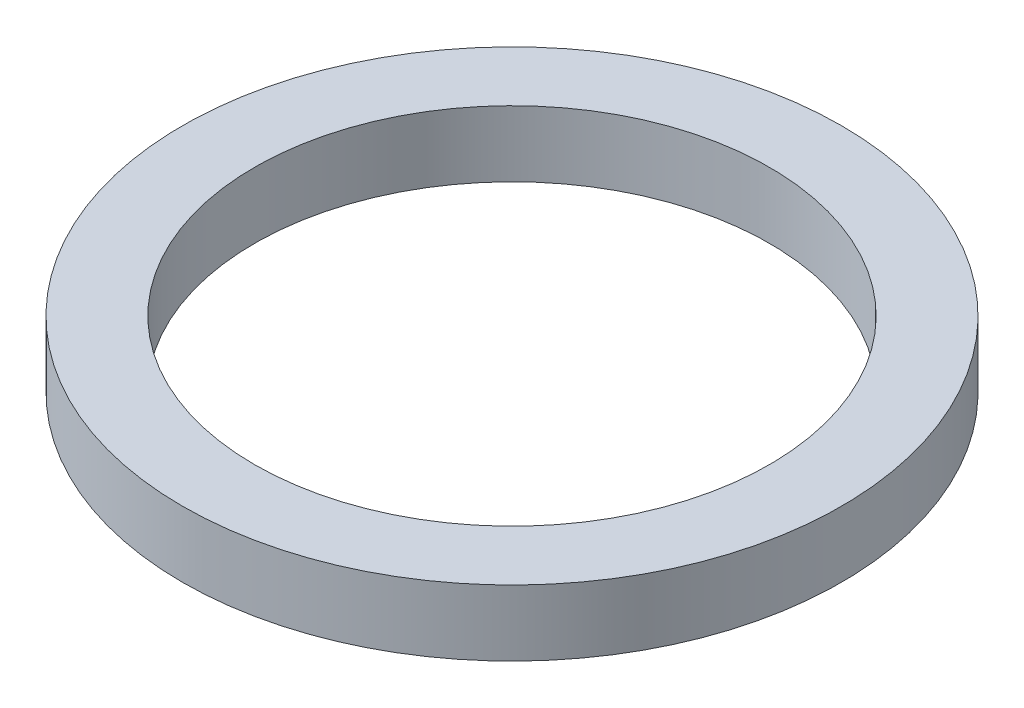
ISO-10303-21;
HEADER;
FILE_DESCRIPTION(('STEP AP214'),'2;1');
FILE_NAME('part.step','',(''),(''),'','','');
FILE_SCHEMA(('AUTOMOTIVE_DESIGN { 1 0 10303 214 1 1 1 1 }'));
ENDSEC;
DATA;
#1=APPLICATION_CONTEXT('core data for automotive mechanical design processes');
#2=APPLICATION_PROTOCOL_DEFINITION('international standard','automotive_design',2000,#1);
#3=PRODUCT_CONTEXT('',#1,'mechanical');
#4=PRODUCT('Part','Part','',(#3));
#5=PRODUCT_RELATED_PRODUCT_CATEGORY('part','',(#4));
#6=PRODUCT_DEFINITION_FORMATION('','',#4);
#7=PRODUCT_DEFINITION_CONTEXT('part definition',#1,'design');
#8=PRODUCT_DEFINITION('design','',#6,#7);
#9=PRODUCT_DEFINITION_SHAPE('','',#8);
#10=(LENGTH_UNIT() NAMED_UNIT(*) SI_UNIT(.MILLI.,.METRE.));
#11=(NAMED_UNIT(*) PLANE_ANGLE_UNIT() SI_UNIT($,.RADIAN.));
#12=(NAMED_UNIT(*) SI_UNIT($,.STERADIAN.) SOLID_ANGLE_UNIT());
#13=UNCERTAINTY_MEASURE_WITH_UNIT(LENGTH_MEASURE(1.E-05),#10,'distance_accuracy_value','');
#14=(GEOMETRIC_REPRESENTATION_CONTEXT(3) GLOBAL_UNCERTAINTY_ASSIGNED_CONTEXT((#13)) GLOBAL_UNIT_ASSIGNED_CONTEXT((#10,
#11,#12)) REPRESENTATION_CONTEXT('',''));
#15=CARTESIAN_POINT('',(0.,0.,0.));
#16=DIRECTION('',(0.,0.,1.));
#17=DIRECTION('',(1.,0.,0.));
#18=AXIS2_PLACEMENT_3D('',#15,#16,#17);
#19=CARTESIAN_POINT('',(0.,5.,0.));
#20=DIRECTION('',(0.,1.,0.));
#21=DIRECTION('',(0.,0.,1.));
#22=AXIS2_PLACEMENT_3D('',#19,#20,#21);
#23=PLANE('',#22);
#24=CARTESIAN_POINT('',(0.,5.,0.));
#25=DIRECTION('',(0.,1.,0.));
#26=DIRECTION('',(0.,0.,1.));
#27=AXIS2_PLACEMENT_3D('',#24,#25,#26);
#28=CIRCLE('',#27,25.);
#29=CARTESIAN_POINT('',(0.,5.,25.));
#30=VERTEX_POINT('',#29);
#31=EDGE_CURVE('E10',#30,#30,#28,.T.);
#32=ORIENTED_EDGE('',*,*,#31,.T.);
#33=EDGE_LOOP('',(#32));
#34=FACE_BOUND('',#33,.T.);
#35=CARTESIAN_POINT('',(0.,5.,0.));
#36=DIRECTION('',(0.,1.,0.));
#37=DIRECTION('',(0.,0.,1.));
#38=AXIS2_PLACEMENT_3D('',#35,#36,#37);
#39=CIRCLE('',#38,19.5349578785374);
#40=CARTESIAN_POINT('',(0.,5.,19.5349578785374));
#41=VERTEX_POINT('',#40);
#42=EDGE_CURVE('E56',#41,#41,#39,.T.);
#43=ORIENTED_EDGE('',*,*,#42,.F.);
#44=EDGE_LOOP('',(#43));
#45=FACE_BOUND('',#44,.T.);
#46=ADVANCED_FACE('F43',(#34,#45),#23,.T.);
#47=CARTESIAN_POINT('',(0.,0.,0.));
#48=DIRECTION('',(0.,1.,0.));
#49=DIRECTION('',(0.,0.,1.));
#50=AXIS2_PLACEMENT_3D('',#47,#48,#49);
#51=PLANE('',#50);
#52=CARTESIAN_POINT('',(0.,0.,0.));
#53=DIRECTION('',(0.,1.,0.));
#54=DIRECTION('',(0.,0.,1.));
#55=AXIS2_PLACEMENT_3D('',#52,#53,#54);
#56=CIRCLE('',#55,25.);
#57=CARTESIAN_POINT('',(0.,0.,25.));
#58=VERTEX_POINT('',#57);
#59=EDGE_CURVE('E47',#58,#58,#56,.T.);
#60=ORIENTED_EDGE('',*,*,#59,.F.);
#61=EDGE_LOOP('',(#60));
#62=FACE_BOUND('',#61,.T.);
#63=CARTESIAN_POINT('',(0.,0.,0.));
#64=DIRECTION('',(0.,1.,0.));
#65=DIRECTION('',(0.,0.,1.));
#66=AXIS2_PLACEMENT_3D('',#63,#64,#65);
#67=CIRCLE('',#66,19.5349578785374);
#68=CARTESIAN_POINT('',(0.,0.,19.5349578785374));
#69=VERTEX_POINT('',#68);
#70=EDGE_CURVE('E58',#69,#69,#67,.T.);
#71=ORIENTED_EDGE('',*,*,#70,.T.);
#72=EDGE_LOOP('',(#71));
#73=FACE_BOUND('',#72,.T.);
#74=ADVANCED_FACE('F70',(#62,#73),#51,.F.);
#75=CARTESIAN_POINT('',(0.,5.,0.));
#76=DIRECTION('',(0.,-1.,0.));
#77=DIRECTION('',(0.,0.,-1.));
#78=AXIS2_PLACEMENT_3D('',#75,#76,#77);
#79=CYLINDRICAL_SURFACE('',#78,25.);
#80=ORIENTED_EDGE('',*,*,#31,.F.);
#81=EDGE_LOOP('',(#80));
#82=FACE_BOUND('',#81,.T.);
#83=ORIENTED_EDGE('',*,*,#59,.T.);
#84=EDGE_LOOP('',(#83));
#85=FACE_BOUND('',#84,.T.);
#86=ADVANCED_FACE('F45',(#82,#85),#79,.T.);
#87=CARTESIAN_POINT('',(0.,5.,0.));
#88=DIRECTION('',(0.,-1.,0.));
#89=DIRECTION('',(0.,0.,-1.));
#90=AXIS2_PLACEMENT_3D('',#87,#88,#89);
#91=CYLINDRICAL_SURFACE('',#90,19.5349578785374);
#92=ORIENTED_EDGE('',*,*,#42,.T.);
#93=EDGE_LOOP('',(#92));
#94=FACE_BOUND('',#93,.T.);
#95=ORIENTED_EDGE('',*,*,#70,.F.);
#96=EDGE_LOOP('',(#95));
#97=FACE_BOUND('',#96,.T.);
#98=ADVANCED_FACE('F66',(#94,#97),#91,.F.);
#99=CLOSED_SHELL('',(#46,#74,#86,#98));
#100=MANIFOLD_SOLID_BREP('B2',#99);
#101=ADVANCED_BREP_SHAPE_REPRESENTATION('',(#18,#100),#14);
#102=SHAPE_DEFINITION_REPRESENTATION(#9,#101);
ENDSEC;
END-ISO-10303-21;
